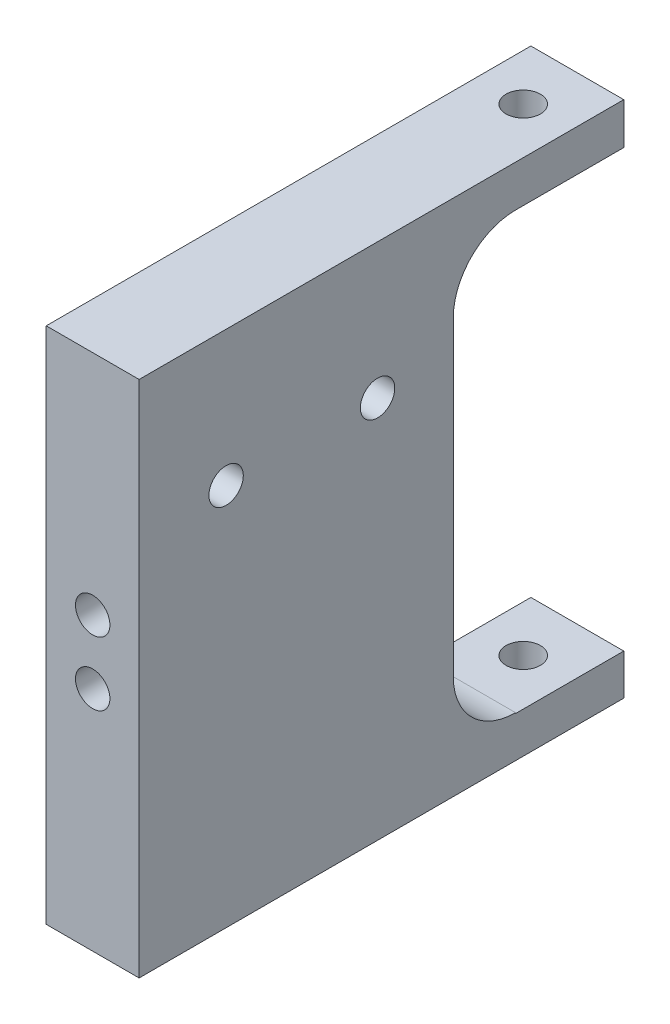
ISO-10303-21;
HEADER;
FILE_DESCRIPTION(('STEP AP214'),'2;1');
FILE_NAME('part.step','',(''),(''),'','','');
FILE_SCHEMA(('AUTOMOTIVE_DESIGN { 1 0 10303 214 1 1 1 1 }'));
ENDSEC;
DATA;
#1=APPLICATION_CONTEXT('core data for automotive mechanical design processes');
#2=APPLICATION_PROTOCOL_DEFINITION('international standard','automotive_design',2000,#1);
#3=PRODUCT_CONTEXT('',#1,'mechanical');
#4=PRODUCT('Part','Part','',(#3));
#5=PRODUCT_RELATED_PRODUCT_CATEGORY('part','',(#4));
#6=PRODUCT_DEFINITION_FORMATION('','',#4);
#7=PRODUCT_DEFINITION_CONTEXT('part definition',#1,'design');
#8=PRODUCT_DEFINITION('design','',#6,#7);
#9=PRODUCT_DEFINITION_SHAPE('','',#8);
#10=(LENGTH_UNIT() NAMED_UNIT(*) SI_UNIT(.MILLI.,.METRE.));
#11=(NAMED_UNIT(*) PLANE_ANGLE_UNIT() SI_UNIT($,.RADIAN.));
#12=(NAMED_UNIT(*) SI_UNIT($,.STERADIAN.) SOLID_ANGLE_UNIT());
#13=UNCERTAINTY_MEASURE_WITH_UNIT(LENGTH_MEASURE(1.E-05),#10,'distance_accuracy_value','');
#14=(GEOMETRIC_REPRESENTATION_CONTEXT(3) GLOBAL_UNCERTAINTY_ASSIGNED_CONTEXT((#13)) GLOBAL_UNIT_ASSIGNED_CONTEXT((#10,
#11,#12)) REPRESENTATION_CONTEXT('',''));
#15=CARTESIAN_POINT('',(0.,0.,0.));
#16=DIRECTION('',(0.,0.,1.));
#17=DIRECTION('',(1.,0.,0.));
#18=AXIS2_PLACEMENT_3D('',#15,#16,#17);
#19=CARTESIAN_POINT('',(22.5004302091405,-15.2604674789245,16.256));
#20=DIRECTION('',(0.,0.,1.));
#21=DIRECTION('',(1.,0.,0.));
#22=AXIS2_PLACEMENT_3D('',#19,#20,#21);
#23=CYLINDRICAL_SURFACE('',#22,2.0193);
#24=CARTESIAN_POINT('',(22.5004302091405,-15.2604674789245,16.256));
#25=DIRECTION('',(0.,0.,1.));
#26=DIRECTION('',(1.,0.,0.));
#27=AXIS2_PLACEMENT_3D('',#24,#25,#26);
#28=CIRCLE('',#27,2.0193);
#29=CARTESIAN_POINT('',(24.5197302091405,-15.2604674789245,16.256));
#30=VERTEX_POINT('',#29);
#31=EDGE_CURVE('E274',#30,#30,#28,.T.);
#32=ORIENTED_EDGE('',*,*,#31,.F.);
#33=EDGE_LOOP('',(#32));
#34=FACE_BOUND('',#33,.T.);
#35=CARTESIAN_POINT('',(22.5004302091405,-15.2604674789245,44.196));
#36=DIRECTION('',(0.,0.,1.));
#37=DIRECTION('',(1.,0.,0.));
#38=AXIS2_PLACEMENT_3D('',#35,#36,#37);
#39=CIRCLE('',#38,2.0193);
#40=CARTESIAN_POINT('',(24.5197302091405,-15.2604674789245,44.196));
#41=VERTEX_POINT('',#40);
#42=EDGE_CURVE('E270',#41,#41,#39,.F.);
#43=ORIENTED_EDGE('',*,*,#42,.F.);
#44=EDGE_LOOP('',(#43));
#45=FACE_BOUND('',#44,.T.);
#46=ADVANCED_FACE('F42',(#34,#45),#23,.F.);
#47=CARTESIAN_POINT('',(24.5197302091405,-15.2604674789245,16.256));
#48=DIRECTION('',(0.,0.,-1.));
#49=DIRECTION('',(-1.,0.,0.));
#50=AXIS2_PLACEMENT_3D('',#47,#48,#49);
#51=PLANE('',#50);
#52=ORIENTED_EDGE('',*,*,#31,.T.);
#53=EDGE_LOOP('',(#52));
#54=FACE_BOUND('',#53,.T.);
#55=ADVANCED_FACE('F308',(#54),#51,.F.);
#56=CARTESIAN_POINT('',(0.,0.,44.196));
#57=DIRECTION('',(0.,0.,1.));
#58=DIRECTION('',(1.,0.,0.));
#59=AXIS2_PLACEMENT_3D('',#56,#57,#58);
#60=PLANE('',#59);
#61=CARTESIAN_POINT('',(22.5004302091405,-22.7566530956906,44.196));
#62=DIRECTION('',(0.,0.,1.));
#63=DIRECTION('',(1.,0.,0.));
#64=AXIS2_PLACEMENT_3D('',#61,#62,#63);
#65=CIRCLE('',#64,2.0193);
#66=CARTESIAN_POINT('',(24.5197302091405,-22.7566530956906,44.196));
#67=VERTEX_POINT('',#66);
#68=EDGE_CURVE('E260',#67,#67,#65,.F.);
#69=ORIENTED_EDGE('',*,*,#68,.T.);
#70=EDGE_LOOP('',(#69));
#71=FACE_BOUND('',#70,.T.);
#72=DIRECTION('',(1.,0.,0.));
#73=VECTOR('',#72,1.);
#74=CARTESIAN_POINT('',(0.,-49.4365080229002,44.196));
#75=LINE('',#74,#73);
#76=CARTESIAN_POINT('',(17.047480418281,-49.4365080229002,44.196));
#77=VERTEX_POINT('',#76);
#78=CARTESIAN_POINT('',(27.95338,-49.4365080229002,44.196));
#79=VERTEX_POINT('',#78);
#80=EDGE_CURVE('E250',#77,#79,#75,.T.);
#81=ORIENTED_EDGE('',*,*,#80,.T.);
#82=DIRECTION('',(0.,1.,0.));
#83=VECTOR('',#82,1.);
#84=CARTESIAN_POINT('',(27.95338,0.,44.196));
#85=LINE('',#84,#83);
#86=CARTESIAN_POINT('',(27.95338,11.4193874482851,44.196));
#87=VERTEX_POINT('',#86);
#88=EDGE_CURVE('E251',#79,#87,#85,.T.);
#89=ORIENTED_EDGE('',*,*,#88,.T.);
#90=DIRECTION('',(-1.,0.,0.));
#91=VECTOR('',#90,1.);
#92=CARTESIAN_POINT('',(0.,11.4193874482851,44.196));
#93=LINE('',#92,#91);
#94=CARTESIAN_POINT('',(17.047480418281,11.4193874482851,44.196));
#95=VERTEX_POINT('',#94);
#96=EDGE_CURVE('E106',#87,#95,#93,.T.);
#97=ORIENTED_EDGE('',*,*,#96,.T.);
#98=DIRECTION('',(0.,-1.,0.));
#99=VECTOR('',#98,1.);
#100=CARTESIAN_POINT('',(17.047480418281,0.,44.196));
#101=LINE('',#100,#99);
#102=EDGE_CURVE('E259',#95,#77,#101,.T.);
#103=ORIENTED_EDGE('',*,*,#102,.T.);
#104=EDGE_LOOP('',(#81,#89,#97,#103));
#105=FACE_BOUND('',#104,.T.);
#106=ORIENTED_EDGE('',*,*,#42,.T.);
#107=EDGE_LOOP('',(#106));
#108=FACE_BOUND('',#107,.T.);
#109=ADVANCED_FACE('F256',(#71,#105,#108),#60,.T.);
#110=CARTESIAN_POINT('',(22.5004302091405,-49.4365080229002,-6.35));
#111=DIRECTION('',(0.,1.,0.));
#112=DIRECTION('',(0.,0.,1.));
#113=AXIS2_PLACEMENT_3D('',#110,#111,#112);
#114=CYLINDRICAL_SURFACE('',#113,2.0193);
#115=CARTESIAN_POINT('',(22.5004302091405,11.4193874482851,-6.35));
#116=DIRECTION('',(0.,1.,0.));
#117=DIRECTION('',(0.,0.,1.));
#118=AXIS2_PLACEMENT_3D('',#115,#116,#117);
#119=CIRCLE('',#118,2.0193);
#120=CARTESIAN_POINT('',(22.5004302091405,11.4193874482851,-4.3307));
#121=VERTEX_POINT('',#120);
#122=EDGE_CURVE('E282',#121,#121,#119,.T.);
#123=ORIENTED_EDGE('',*,*,#122,.T.);
#124=EDGE_LOOP('',(#123));
#125=FACE_BOUND('',#124,.T.);
#126=CARTESIAN_POINT('',(22.5004302091405,6.54303999999922,-6.35));
#127=DIRECTION('',(0.,1.,0.));
#128=DIRECTION('',(0.,0.,1.));
#129=AXIS2_PLACEMENT_3D('',#126,#127,#128);
#130=CIRCLE('',#129,2.0193);
#131=CARTESIAN_POINT('',(22.5004302091405,6.54303999999922,-4.3307));
#132=VERTEX_POINT('',#131);
#133=EDGE_CURVE('E180',#132,#132,#130,.T.);
#134=ORIENTED_EDGE('',*,*,#133,.F.);
#135=EDGE_LOOP('',(#134));
#136=FACE_BOUND('',#135,.T.);
#137=ADVANCED_FACE('F296',(#125,#136),#114,.F.);
#138=CARTESIAN_POINT('',(27.95338,-44.6430400000007,-12.7));
#139=DIRECTION('',(0.,-1.,0.));
#140=DIRECTION('',(1.,0.,0.));
#141=AXIS2_PLACEMENT_3D('',#138,#139,#140);
#142=PLANE('',#141);
#143=CARTESIAN_POINT('',(22.5004302091405,-44.6430400000007,-6.35));
#144=DIRECTION('',(0.,-1.,0.));
#145=DIRECTION('',(1.,0.,0.));
#146=AXIS2_PLACEMENT_3D('',#143,#144,#145);
#147=CIRCLE('',#146,2.0193);
#148=CARTESIAN_POINT('',(24.5197302091405,-44.6430400000007,-6.35));
#149=VERTEX_POINT('',#148);
#150=EDGE_CURVE('E46',#149,#149,#147,.T.);
#151=ORIENTED_EDGE('',*,*,#150,.T.);
#152=EDGE_LOOP('',(#151));
#153=FACE_BOUND('',#152,.T.);
#154=DIRECTION('',(0.,0.,1.));
#155=VECTOR('',#154,1.);
#156=CARTESIAN_POINT('',(17.047480418281,-44.6430400000007,-12.7));
#157=LINE('',#156,#155);
#158=CARTESIAN_POINT('',(17.047480418281,-44.6430400000007,-12.7));
#159=VERTEX_POINT('',#158);
#160=CARTESIAN_POINT('',(17.047480418281,-44.6430400000007,0.));
#161=VERTEX_POINT('',#160);
#162=EDGE_CURVE('E179',#159,#161,#157,.T.);
#163=ORIENTED_EDGE('',*,*,#162,.T.);
#164=DIRECTION('',(-1.,0.,0.));
#165=VECTOR('',#164,1.);
#166=CARTESIAN_POINT('',(27.95338,-44.6430400000007,0.));
#167=LINE('',#166,#165);
#168=CARTESIAN_POINT('',(27.95338,-44.6430400000007,0.));
#169=VERTEX_POINT('',#168);
#170=EDGE_CURVE('E156',#169,#161,#167,.T.);
#171=ORIENTED_EDGE('',*,*,#170,.F.);
#172=DIRECTION('',(0.,0.,1.));
#173=VECTOR('',#172,1.);
#174=CARTESIAN_POINT('',(27.95338,-44.6430400000007,-12.7));
#175=LINE('',#174,#173);
#176=CARTESIAN_POINT('',(27.95338,-44.6430400000007,-12.7));
#177=VERTEX_POINT('',#176);
#178=EDGE_CURVE('E200',#177,#169,#175,.T.);
#179=ORIENTED_EDGE('',*,*,#178,.F.);
#180=DIRECTION('',(-1.,0.,0.));
#181=VECTOR('',#180,1.);
#182=CARTESIAN_POINT('',(27.95338,-44.6430400000007,-12.7));
#183=LINE('',#182,#181);
#184=EDGE_CURVE('E158',#177,#159,#183,.T.);
#185=ORIENTED_EDGE('',*,*,#184,.T.);
#186=EDGE_LOOP('',(#163,#171,#179,#185));
#187=FACE_BOUND('',#186,.T.);
#188=ADVANCED_FACE('F298',(#153,#187),#142,.F.);
#189=CARTESIAN_POINT('',(27.95338,-44.6430400000007,0.));
#190=DIRECTION('',(0.,0.,1.));
#191=DIRECTION('',(0.,-1.,0.));
#192=AXIS2_PLACEMENT_3D('',#189,#190,#191);
#193=PLANE('',#192);
#194=DIRECTION('',(0.,1.,0.));
#195=VECTOR('',#194,1.);
#196=CARTESIAN_POINT('',(17.047480418281,-44.6430400000007,0.));
#197=LINE('',#196,#195);
#198=CARTESIAN_POINT('',(17.047480418281,-44.5601605746144,0.));
#199=VERTEX_POINT('',#198);
#200=EDGE_CURVE('E184',#161,#199,#197,.T.);
#201=ORIENTED_EDGE('',*,*,#200,.T.);
#202=DIRECTION('',(-1.,0.,0.));
#203=VECTOR('',#202,1.);
#204=CARTESIAN_POINT('',(27.95338,-44.5601605746144,0.));
#205=LINE('',#204,#203);
#206=CARTESIAN_POINT('',(27.95338,-44.5601605746144,0.));
#207=VERTEX_POINT('',#206);
#208=EDGE_CURVE('E153',#207,#199,#205,.T.);
#209=ORIENTED_EDGE('',*,*,#208,.F.);
#210=DIRECTION('',(0.,1.,0.));
#211=VECTOR('',#210,1.);
#212=CARTESIAN_POINT('',(27.95338,-44.6430400000007,0.));
#213=LINE('',#212,#211);
#214=EDGE_CURVE('E59',#169,#207,#213,.T.);
#215=ORIENTED_EDGE('',*,*,#214,.F.);
#216=ORIENTED_EDGE('',*,*,#170,.T.);
#217=EDGE_LOOP('',(#201,#209,#215,#216));
#218=FACE_BOUND('',#217,.T.);
#219=ADVANCED_FACE('F306',(#218),#193,.F.);
#220=CARTESIAN_POINT('',(27.95338,-37.2449605746144,0.));
#221=DIRECTION('',(-1.,0.,0.));
#222=DIRECTION('',(0.,-1.,0.));
#223=AXIS2_PLACEMENT_3D('',#220,#221,#222);
#224=CYLINDRICAL_SURFACE('',#223,7.3152);
#225=CARTESIAN_POINT('',(17.047480418281,-37.2449605746144,0.));
#226=DIRECTION('',(-1.,0.,0.));
#227=DIRECTION('',(0.,-1.,0.));
#228=AXIS2_PLACEMENT_3D('',#225,#226,#227);
#229=CIRCLE('',#228,7.3152);
#230=CARTESIAN_POINT('',(17.047480418281,-37.2449605746144,7.3152));
#231=VERTEX_POINT('',#230);
#232=EDGE_CURVE('E187',#199,#231,#229,.T.);
#233=ORIENTED_EDGE('',*,*,#232,.T.);
#234=DIRECTION('',(-1.,0.,0.));
#235=VECTOR('',#234,1.);
#236=CARTESIAN_POINT('',(27.95338,-37.2449605746144,7.3152));
#237=LINE('',#236,#235);
#238=CARTESIAN_POINT('',(27.95338,-37.2449605746144,7.3152));
#239=VERTEX_POINT('',#238);
#240=EDGE_CURVE('E144',#239,#231,#237,.T.);
#241=ORIENTED_EDGE('',*,*,#240,.F.);
#242=CARTESIAN_POINT('',(27.95338,-37.2449605746144,0.));
#243=DIRECTION('',(-1.,0.,0.));
#244=DIRECTION('',(0.,-1.,0.));
#245=AXIS2_PLACEMENT_3D('',#242,#243,#244);
#246=CIRCLE('',#245,7.3152);
#247=EDGE_CURVE('E173',#207,#239,#246,.T.);
#248=ORIENTED_EDGE('',*,*,#247,.F.);
#249=ORIENTED_EDGE('',*,*,#208,.T.);
#250=EDGE_LOOP('',(#233,#241,#248,#249));
#251=FACE_BOUND('',#250,.T.);
#252=ADVANCED_FACE('F217',(#251),#224,.F.);
#253=CARTESIAN_POINT('',(27.95338,-37.2449605746144,7.3152));
#254=DIRECTION('',(0.,0.,1.));
#255=DIRECTION('',(1.,0.,0.));
#256=AXIS2_PLACEMENT_3D('',#253,#254,#255);
#257=PLANE('',#256);
#258=DIRECTION('',(0.,1.,0.));
#259=VECTOR('',#258,1.);
#260=CARTESIAN_POINT('',(17.047480418281,-37.2449605746144,7.3152));
#261=LINE('',#260,#259);
#262=CARTESIAN_POINT('',(17.047480418281,-0.772160000000771,7.3152));
#263=VERTEX_POINT('',#262);
#264=EDGE_CURVE('E190',#231,#263,#261,.T.);
#265=ORIENTED_EDGE('',*,*,#264,.T.);
#266=DIRECTION('',(-1.,0.,0.));
#267=VECTOR('',#266,1.);
#268=CARTESIAN_POINT('',(27.95338,-0.772160000000771,7.3152));
#269=LINE('',#268,#267);
#270=CARTESIAN_POINT('',(27.95338,-0.772160000000771,7.3152));
#271=VERTEX_POINT('',#270);
#272=EDGE_CURVE('E133',#271,#263,#269,.T.);
#273=ORIENTED_EDGE('',*,*,#272,.F.);
#274=DIRECTION('',(0.,1.,0.));
#275=VECTOR('',#274,1.);
#276=CARTESIAN_POINT('',(27.95338,-37.2449605746144,7.3152));
#277=LINE('',#276,#275);
#278=EDGE_CURVE('E168',#239,#271,#277,.T.);
#279=ORIENTED_EDGE('',*,*,#278,.F.);
#280=ORIENTED_EDGE('',*,*,#240,.T.);
#281=EDGE_LOOP('',(#265,#273,#279,#280));
#282=FACE_BOUND('',#281,.T.);
#283=ADVANCED_FACE('F392',(#282),#257,.F.);
#284=CARTESIAN_POINT('',(27.95338,-0.772160000000778,0.));
#285=DIRECTION('',(-1.,0.,0.));
#286=DIRECTION('',(0.,-1.,0.));
#287=AXIS2_PLACEMENT_3D('',#284,#285,#286);
#288=CYLINDRICAL_SURFACE('',#287,7.3152);
#289=CARTESIAN_POINT('',(17.047480418281,-0.772160000000778,0.));
#290=DIRECTION('',(-1.,0.,0.));
#291=DIRECTION('',(0.,-1.,0.));
#292=AXIS2_PLACEMENT_3D('',#289,#290,#291);
#293=CIRCLE('',#292,7.3152);
#294=CARTESIAN_POINT('',(17.047480418281,6.54303999999922,0.));
#295=VERTEX_POINT('',#294);
#296=EDGE_CURVE('E147',#263,#295,#293,.T.);
#297=ORIENTED_EDGE('',*,*,#296,.T.);
#298=DIRECTION('',(-1.,0.,0.));
#299=VECTOR('',#298,1.);
#300=CARTESIAN_POINT('',(27.95338,6.54303999999922,0.));
#301=LINE('',#300,#299);
#302=CARTESIAN_POINT('',(27.95338,6.54303999999922,0.));
#303=VERTEX_POINT('',#302);
#304=EDGE_CURVE('E129',#303,#295,#301,.T.);
#305=ORIENTED_EDGE('',*,*,#304,.F.);
#306=CARTESIAN_POINT('',(27.95338,-0.772160000000778,0.));
#307=DIRECTION('',(-1.,0.,0.));
#308=DIRECTION('',(0.,-1.,0.));
#309=AXIS2_PLACEMENT_3D('',#306,#307,#308);
#310=CIRCLE('',#309,7.3152);
#311=EDGE_CURVE('E164',#271,#303,#310,.T.);
#312=ORIENTED_EDGE('',*,*,#311,.F.);
#313=ORIENTED_EDGE('',*,*,#272,.T.);
#314=EDGE_LOOP('',(#297,#305,#312,#313));
#315=FACE_BOUND('',#314,.T.);
#316=ADVANCED_FACE('F388',(#315),#288,.F.);
#317=CARTESIAN_POINT('',(27.95338,6.54303999999922,0.));
#318=DIRECTION('',(0.,1.,0.));
#319=DIRECTION('',(0.,0.,1.));
#320=AXIS2_PLACEMENT_3D('',#317,#318,#319);
#321=PLANE('',#320);
#322=ORIENTED_EDGE('',*,*,#133,.T.);
#323=EDGE_LOOP('',(#322));
#324=FACE_BOUND('',#323,.T.);
#325=DIRECTION('',(0.,0.,-1.));
#326=VECTOR('',#325,1.);
#327=CARTESIAN_POINT('',(17.047480418281,6.54303999999922,0.));
#328=LINE('',#327,#326);
#329=CARTESIAN_POINT('',(17.047480418281,6.54303999999922,-12.7));
#330=VERTEX_POINT('',#329);
#331=EDGE_CURVE('E177',#295,#330,#328,.T.);
#332=ORIENTED_EDGE('',*,*,#331,.T.);
#333=DIRECTION('',(-1.,0.,0.));
#334=VECTOR('',#333,1.);
#335=CARTESIAN_POINT('',(27.95338,6.54303999999922,-12.7));
#336=LINE('',#335,#334);
#337=CARTESIAN_POINT('',(27.95338,6.54303999999922,-12.7));
#338=VERTEX_POINT('',#337);
#339=EDGE_CURVE('E162',#338,#330,#336,.T.);
#340=ORIENTED_EDGE('',*,*,#339,.F.);
#341=DIRECTION('',(0.,0.,-1.));
#342=VECTOR('',#341,1.);
#343=CARTESIAN_POINT('',(27.95338,6.54303999999922,0.));
#344=LINE('',#343,#342);
#345=EDGE_CURVE('E94',#303,#338,#344,.T.);
#346=ORIENTED_EDGE('',*,*,#345,.F.);
#347=ORIENTED_EDGE('',*,*,#304,.T.);
#348=EDGE_LOOP('',(#332,#340,#346,#347));
#349=FACE_BOUND('',#348,.T.);
#350=ADVANCED_FACE('F294',(#324,#349),#321,.F.);
#351=CARTESIAN_POINT('',(17.047480418281,-49.4365080229002,-12.7));
#352=DIRECTION('',(0.,0.,-1.));
#353=DIRECTION('',(-1.,0.,0.));
#354=AXIS2_PLACEMENT_3D('',#351,#352,#353);
#355=PLANE('',#354);
#356=ORIENTED_EDGE('',*,*,#339,.T.);
#357=DIRECTION('',(0.,1.,0.));
#358=VECTOR('',#357,1.);
#359=CARTESIAN_POINT('',(17.047480418281,-49.4365080229002,-12.7));
#360=LINE('',#359,#358);
#361=CARTESIAN_POINT('',(17.047480418281,11.4193874482851,-12.7));
#362=VERTEX_POINT('',#361);
#363=EDGE_CURVE('E67',#330,#362,#360,.T.);
#364=ORIENTED_EDGE('',*,*,#363,.T.);
#365=DIRECTION('',(1.,0.,0.));
#366=VECTOR('',#365,1.);
#367=CARTESIAN_POINT('',(17.047480418281,11.4193874482851,-12.7));
#368=LINE('',#367,#366);
#369=CARTESIAN_POINT('',(27.95338,11.4193874482851,-12.7));
#370=VERTEX_POINT('',#369);
#371=EDGE_CURVE('E11',#362,#370,#368,.T.);
#372=ORIENTED_EDGE('',*,*,#371,.T.);
#373=DIRECTION('',(0.,1.,0.));
#374=VECTOR('',#373,1.);
#375=CARTESIAN_POINT('',(27.95338,-49.4365080229002,-12.7));
#376=LINE('',#375,#374);
#377=EDGE_CURVE('E84',#338,#370,#376,.T.);
#378=ORIENTED_EDGE('',*,*,#377,.F.);
#379=EDGE_LOOP('',(#356,#364,#372,#378));
#380=FACE_BOUND('',#379,.T.);
#381=ADVANCED_FACE('F99',(#380),#355,.T.);
#382=ORIENTED_EDGE('',*,*,#184,.F.);
#383=CARTESIAN_POINT('',(27.95338,-49.4365080229002,-12.7));
#384=VERTEX_POINT('',#383);
#385=EDGE_CURVE('E96',#384,#177,#376,.T.);
#386=ORIENTED_EDGE('',*,*,#385,.F.);
#387=DIRECTION('',(1.,0.,0.));
#388=VECTOR('',#387,1.);
#389=CARTESIAN_POINT('',(17.047480418281,-49.4365080229002,-12.7));
#390=LINE('',#389,#388);
#391=CARTESIAN_POINT('',(17.047480418281,-49.4365080229002,-12.7));
#392=VERTEX_POINT('',#391);
#393=EDGE_CURVE('E51',#392,#384,#390,.T.);
#394=ORIENTED_EDGE('',*,*,#393,.F.);
#395=EDGE_CURVE('E121',#392,#159,#360,.T.);
#396=ORIENTED_EDGE('',*,*,#395,.T.);
#397=EDGE_LOOP('',(#382,#386,#394,#396));
#398=FACE_BOUND('',#397,.T.);
#399=ADVANCED_FACE('F314',(#398),#355,.T.);
#400=CARTESIAN_POINT('',(22.5004302091405,-49.4365080229002,-6.35));
#401=DIRECTION('',(0.,1.,0.));
#402=DIRECTION('',(0.,0.,1.));
#403=AXIS2_PLACEMENT_3D('',#400,#401,#402);
#404=CIRCLE('',#403,2.0193);
#405=CARTESIAN_POINT('',(22.5004302091405,-49.4365080229002,-4.3307));
#406=VERTEX_POINT('',#405);
#407=EDGE_CURVE('E284',#406,#406,#404,.T.);
#408=ORIENTED_EDGE('',*,*,#407,.F.);
#409=EDGE_LOOP('',(#408));
#410=FACE_BOUND('',#409,.T.);
#411=ORIENTED_EDGE('',*,*,#150,.F.);
#412=EDGE_LOOP('',(#411));
#413=FACE_BOUND('',#412,.T.);
#414=ADVANCED_FACE('F301',(#410,#413),#114,.F.);
#415=CARTESIAN_POINT('',(17.047480418281,-49.4365080229002,28.956));
#416=DIRECTION('',(0.,-1.,0.));
#417=DIRECTION('',(0.,0.,-1.));
#418=AXIS2_PLACEMENT_3D('',#415,#416,#417);
#419=PLANE('',#418);
#420=ORIENTED_EDGE('',*,*,#407,.T.);
#421=EDGE_LOOP('',(#420));
#422=FACE_BOUND('',#421,.T.);
#423=DIRECTION('',(0.,0.,-1.));
#424=VECTOR('',#423,1.);
#425=CARTESIAN_POINT('',(27.95338,-49.4365080229002,28.956));
#426=LINE('',#425,#424);
#427=EDGE_CURVE('E97',#79,#384,#426,.T.);
#428=ORIENTED_EDGE('',*,*,#427,.F.);
#429=ORIENTED_EDGE('',*,*,#80,.F.);
#430=DIRECTION('',(0.,0.,-1.));
#431=VECTOR('',#430,1.);
#432=CARTESIAN_POINT('',(17.047480418281,-49.4365080229002,28.956));
#433=LINE('',#432,#431);
#434=EDGE_CURVE('E107',#77,#392,#433,.T.);
#435=ORIENTED_EDGE('',*,*,#434,.T.);
#436=ORIENTED_EDGE('',*,*,#393,.T.);
#437=EDGE_LOOP('',(#428,#429,#435,#436));
#438=FACE_BOUND('',#437,.T.);
#439=ADVANCED_FACE('F44',(#422,#438),#419,.T.);
#440=CARTESIAN_POINT('',(17.047480418281,0.,0.));
#441=DIRECTION('',(1.,0.,0.));
#442=DIRECTION('',(0.,0.,-1.));
#443=AXIS2_PLACEMENT_3D('',#440,#441,#442);
#444=PLANE('',#443);
#445=CARTESIAN_POINT('',(17.047480418281,-4.4659391214843,16.2052));
#446=DIRECTION('',(1.,0.,0.));
#447=DIRECTION('',(0.,0.,-1.));
#448=AXIS2_PLACEMENT_3D('',#445,#446,#447);
#449=CIRCLE('',#448,2.0193);
#450=CARTESIAN_POINT('',(17.047480418281,-4.4659391214843,14.1859));
#451=VERTEX_POINT('',#450);
#452=EDGE_CURVE('E355',#451,#451,#449,.T.);
#453=ORIENTED_EDGE('',*,*,#452,.T.);
#454=EDGE_LOOP('',(#453));
#455=FACE_BOUND('',#454,.T.);
#456=CARTESIAN_POINT('',(17.047480418281,-4.4659391214843,33.9852));
#457=DIRECTION('',(1.,0.,0.));
#458=DIRECTION('',(0.,0.,-1.));
#459=AXIS2_PLACEMENT_3D('',#456,#457,#458);
#460=CIRCLE('',#459,2.0193);
#461=CARTESIAN_POINT('',(17.047480418281,-4.4659391214843,31.9659));
#462=VERTEX_POINT('',#461);
#463=EDGE_CURVE('E264',#462,#462,#460,.T.);
#464=ORIENTED_EDGE('',*,*,#463,.T.);
#465=EDGE_LOOP('',(#464));
#466=FACE_BOUND('',#465,.T.);
#467=ORIENTED_EDGE('',*,*,#363,.F.);
#468=ORIENTED_EDGE('',*,*,#331,.F.);
#469=ORIENTED_EDGE('',*,*,#296,.F.);
#470=ORIENTED_EDGE('',*,*,#264,.F.);
#471=ORIENTED_EDGE('',*,*,#232,.F.);
#472=ORIENTED_EDGE('',*,*,#200,.F.);
#473=ORIENTED_EDGE('',*,*,#162,.F.);
#474=ORIENTED_EDGE('',*,*,#395,.F.);
#475=ORIENTED_EDGE('',*,*,#434,.F.);
#476=ORIENTED_EDGE('',*,*,#102,.F.);
#477=DIRECTION('',(0.,0.,1.));
#478=VECTOR('',#477,1.);
#479=CARTESIAN_POINT('',(17.047480418281,11.4193874482851,-12.7));
#480=LINE('',#479,#478);
#481=EDGE_CURVE('E116',#362,#95,#480,.T.);
#482=ORIENTED_EDGE('',*,*,#481,.F.);
#483=EDGE_LOOP('',(#467,#468,#469,#470,#471,#472,#473,#474,#475,#476,#482));
#484=FACE_BOUND('',#483,.T.);
#485=ADVANCED_FACE('F370',(#455,#466,#484),#444,.F.);
#486=CARTESIAN_POINT('',(17.047480418281,11.4193874482851,-12.7));
#487=DIRECTION('',(0.,1.,0.));
#488=DIRECTION('',(0.,0.,1.));
#489=AXIS2_PLACEMENT_3D('',#486,#487,#488);
#490=PLANE('',#489);
#491=ORIENTED_EDGE('',*,*,#122,.F.);
#492=EDGE_LOOP('',(#491));
#493=FACE_BOUND('',#492,.T.);
#494=DIRECTION('',(0.,0.,1.));
#495=VECTOR('',#494,1.);
#496=CARTESIAN_POINT('',(27.95338,11.4193874482851,-12.7));
#497=LINE('',#496,#495);
#498=EDGE_CURVE('E89',#370,#87,#497,.T.);
#499=ORIENTED_EDGE('',*,*,#498,.F.);
#500=ORIENTED_EDGE('',*,*,#371,.F.);
#501=ORIENTED_EDGE('',*,*,#481,.T.);
#502=ORIENTED_EDGE('',*,*,#96,.F.);
#503=EDGE_LOOP('',(#499,#500,#501,#502));
#504=FACE_BOUND('',#503,.T.);
#505=ADVANCED_FACE('F104',(#493,#504),#490,.T.);
#506=CARTESIAN_POINT('',(27.95338,0.,0.));
#507=DIRECTION('',(1.,0.,0.));
#508=DIRECTION('',(0.,0.,-1.));
#509=AXIS2_PLACEMENT_3D('',#506,#507,#508);
#510=PLANE('',#509);
#511=CARTESIAN_POINT('',(27.95338,-4.4659391214843,16.2052));
#512=DIRECTION('',(1.,0.,0.));
#513=DIRECTION('',(0.,0.,-1.));
#514=AXIS2_PLACEMENT_3D('',#511,#512,#513);
#515=CIRCLE('',#514,2.0193);
#516=CARTESIAN_POINT('',(27.95338,-4.4659391214843,14.1859));
#517=VERTEX_POINT('',#516);
#518=EDGE_CURVE('E358',#517,#517,#515,.T.);
#519=ORIENTED_EDGE('',*,*,#518,.F.);
#520=EDGE_LOOP('',(#519));
#521=FACE_BOUND('',#520,.T.);
#522=CARTESIAN_POINT('',(27.95338,-4.4659391214843,33.9852));
#523=DIRECTION('',(1.,0.,0.));
#524=DIRECTION('',(0.,0.,-1.));
#525=AXIS2_PLACEMENT_3D('',#522,#523,#524);
#526=CIRCLE('',#525,2.0193);
#527=CARTESIAN_POINT('',(27.95338,-4.4659391214843,31.9659));
#528=VERTEX_POINT('',#527);
#529=EDGE_CURVE('E353',#528,#528,#526,.T.);
#530=ORIENTED_EDGE('',*,*,#529,.F.);
#531=EDGE_LOOP('',(#530));
#532=FACE_BOUND('',#531,.T.);
#533=ORIENTED_EDGE('',*,*,#345,.T.);
#534=ORIENTED_EDGE('',*,*,#377,.T.);
#535=ORIENTED_EDGE('',*,*,#498,.T.);
#536=ORIENTED_EDGE('',*,*,#88,.F.);
#537=ORIENTED_EDGE('',*,*,#427,.T.);
#538=ORIENTED_EDGE('',*,*,#385,.T.);
#539=ORIENTED_EDGE('',*,*,#178,.T.);
#540=ORIENTED_EDGE('',*,*,#214,.T.);
#541=ORIENTED_EDGE('',*,*,#247,.T.);
#542=ORIENTED_EDGE('',*,*,#278,.T.);
#543=ORIENTED_EDGE('',*,*,#311,.T.);
#544=EDGE_LOOP('',(#533,#534,#535,#536,#537,#538,#539,#540,#541,#542,#543));
#545=FACE_BOUND('',#544,.T.);
#546=ADVANCED_FACE('F85',(#521,#532,#545),#510,.T.);
#547=CARTESIAN_POINT('',(24.5197302091405,-22.7566530956906,16.256));
#548=DIRECTION('',(0.,0.,-1.));
#549=DIRECTION('',(-1.,0.,0.));
#550=AXIS2_PLACEMENT_3D('',#547,#548,#549);
#551=PLANE('',#550);
#552=CARTESIAN_POINT('',(22.5004302091405,-22.7566530956906,16.256));
#553=DIRECTION('',(0.,0.,1.));
#554=DIRECTION('',(1.,0.,0.));
#555=AXIS2_PLACEMENT_3D('',#552,#553,#554);
#556=CIRCLE('',#555,2.0193);
#557=CARTESIAN_POINT('',(24.5197302091405,-22.7566530956906,16.256));
#558=VERTEX_POINT('',#557);
#559=EDGE_CURVE('E278',#558,#558,#556,.T.);
#560=ORIENTED_EDGE('',*,*,#559,.T.);
#561=EDGE_LOOP('',(#560));
#562=FACE_BOUND('',#561,.T.);
#563=ADVANCED_FACE('F327',(#562),#551,.F.);
#564=CARTESIAN_POINT('',(22.5004302091405,-22.7566530956906,16.256));
#565=DIRECTION('',(0.,0.,1.));
#566=DIRECTION('',(1.,0.,0.));
#567=AXIS2_PLACEMENT_3D('',#564,#565,#566);
#568=CYLINDRICAL_SURFACE('',#567,2.0193);
#569=ORIENTED_EDGE('',*,*,#559,.F.);
#570=EDGE_LOOP('',(#569));
#571=FACE_BOUND('',#570,.T.);
#572=ORIENTED_EDGE('',*,*,#68,.F.);
#573=EDGE_LOOP('',(#572));
#574=FACE_BOUND('',#573,.T.);
#575=ADVANCED_FACE('F329',(#571,#574),#568,.F.);
#576=CARTESIAN_POINT('',(17.047480418281,-4.4659391214843,33.9852));
#577=DIRECTION('',(1.,0.,0.));
#578=DIRECTION('',(0.,0.,-1.));
#579=AXIS2_PLACEMENT_3D('',#576,#577,#578);
#580=CYLINDRICAL_SURFACE('',#579,2.0193);
#581=ORIENTED_EDGE('',*,*,#463,.F.);
#582=EDGE_LOOP('',(#581));
#583=FACE_BOUND('',#582,.T.);
#584=ORIENTED_EDGE('',*,*,#529,.T.);
#585=EDGE_LOOP('',(#584));
#586=FACE_BOUND('',#585,.T.);
#587=ADVANCED_FACE('F332',(#583,#586),#580,.F.);
#588=CARTESIAN_POINT('',(17.047480418281,-4.4659391214843,16.2052));
#589=DIRECTION('',(1.,0.,0.));
#590=DIRECTION('',(0.,0.,-1.));
#591=AXIS2_PLACEMENT_3D('',#588,#589,#590);
#592=CYLINDRICAL_SURFACE('',#591,2.0193);
#593=ORIENTED_EDGE('',*,*,#452,.F.);
#594=EDGE_LOOP('',(#593));
#595=FACE_BOUND('',#594,.T.);
#596=ORIENTED_EDGE('',*,*,#518,.T.);
#597=EDGE_LOOP('',(#596));
#598=FACE_BOUND('',#597,.T.);
#599=ADVANCED_FACE('F337',(#595,#598),#592,.F.);
#600=CLOSED_SHELL('',(#46,#55,#109,#137,#188,#219,#252,#283,#316,#350,#381,#399,#414,#439,#485,
#505,#546,#563,#575,#587,#599));
#601=MANIFOLD_SOLID_BREP('B2',#600);
#602=ADVANCED_BREP_SHAPE_REPRESENTATION('',(#18,#601),#14);
#603=SHAPE_DEFINITION_REPRESENTATION(#9,#602);
ENDSEC;
END-ISO-10303-21;
